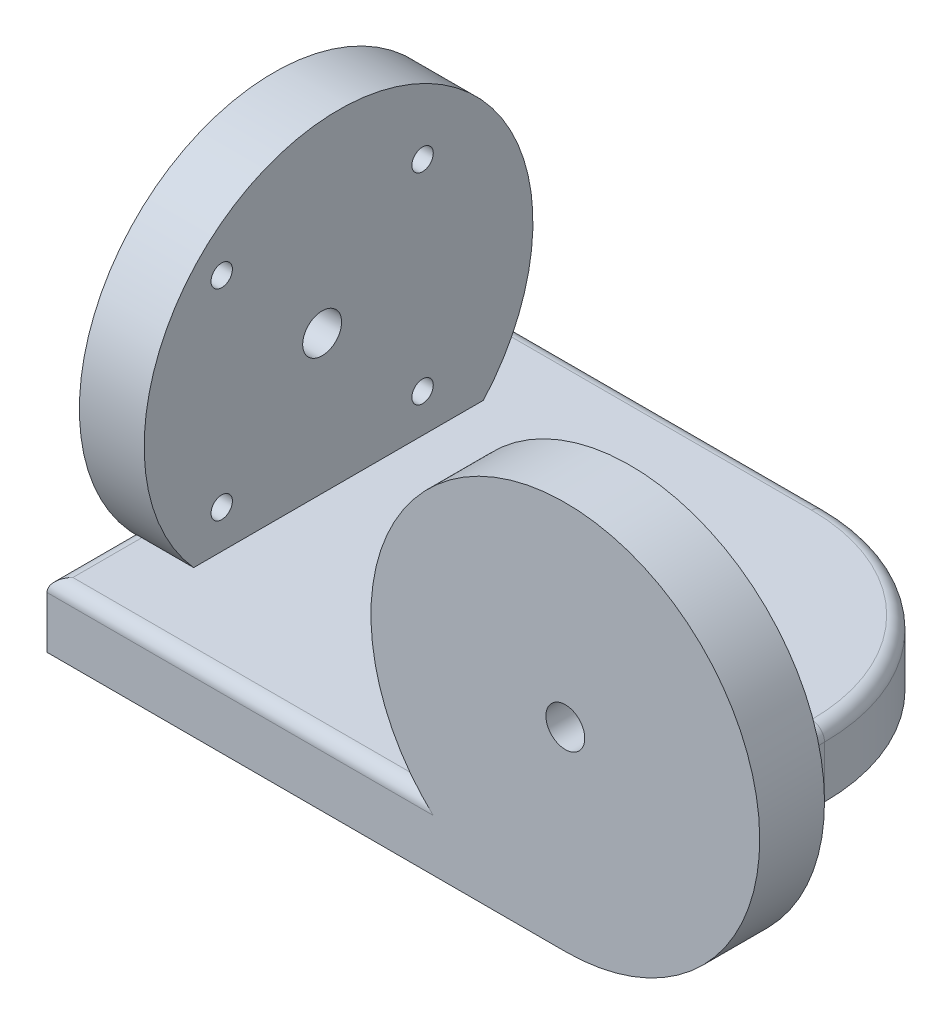
ISO-10303-21;
HEADER;
FILE_DESCRIPTION(('STEP AP214'),'2;1');
FILE_NAME('part.step','',(''),(''),'','','');
FILE_SCHEMA(('AUTOMOTIVE_DESIGN { 1 0 10303 214 1 1 1 1 }'));
ENDSEC;
DATA;
#1=APPLICATION_CONTEXT('core data for automotive mechanical design processes');
#2=APPLICATION_PROTOCOL_DEFINITION('international standard','automotive_design',2000,#1);
#3=PRODUCT_CONTEXT('',#1,'mechanical');
#4=PRODUCT('Part','Part','',(#3));
#5=PRODUCT_RELATED_PRODUCT_CATEGORY('part','',(#4));
#6=PRODUCT_DEFINITION_FORMATION('','',#4);
#7=PRODUCT_DEFINITION_CONTEXT('part definition',#1,'design');
#8=PRODUCT_DEFINITION('design','',#6,#7);
#9=PRODUCT_DEFINITION_SHAPE('','',#8);
#10=(LENGTH_UNIT() NAMED_UNIT(*) SI_UNIT(.MILLI.,.METRE.));
#11=(NAMED_UNIT(*) PLANE_ANGLE_UNIT() SI_UNIT($,.RADIAN.));
#12=(NAMED_UNIT(*) SI_UNIT($,.STERADIAN.) SOLID_ANGLE_UNIT());
#13=UNCERTAINTY_MEASURE_WITH_UNIT(LENGTH_MEASURE(1.E-05),#10,'distance_accuracy_value','');
#14=(GEOMETRIC_REPRESENTATION_CONTEXT(3) GLOBAL_UNCERTAINTY_ASSIGNED_CONTEXT((#13)) GLOBAL_UNIT_ASSIGNED_CONTEXT((#10,
#11,#12)) REPRESENTATION_CONTEXT('',''));
#15=CARTESIAN_POINT('',(0.,0.,0.));
#16=DIRECTION('',(0.,0.,1.));
#17=DIRECTION('',(1.,0.,0.));
#18=AXIS2_PLACEMENT_3D('',#15,#16,#17);
#19=CARTESIAN_POINT('',(0.,0.,10.));
#20=DIRECTION('',(0.,0.,-1.));
#21=DIRECTION('',(-1.,0.,0.));
#22=AXIS2_PLACEMENT_3D('',#19,#20,#21);
#23=CYLINDRICAL_SURFACE('',#22,30.);
#24=CARTESIAN_POINT('',(0.,0.,10.));
#25=DIRECTION('',(0.,0.,1.));
#26=DIRECTION('',(1.,0.,0.));
#27=AXIS2_PLACEMENT_3D('',#24,#25,#26);
#28=CIRCLE('',#27,30.);
#29=CARTESIAN_POINT('',(0.,-30.,10.));
#30=VERTEX_POINT('',#29);
#31=CARTESIAN_POINT('',(-20.3960780543711,-22.,10.));
#32=VERTEX_POINT('',#31);
#33=EDGE_CURVE('E54',#30,#32,#28,.T.);
#34=ORIENTED_EDGE('',*,*,#33,.F.);
#35=DIRECTION('',(0.,0.,1.));
#36=VECTOR('',#35,1.);
#37=CARTESIAN_POINT('',(0.,-30.,-60.));
#38=LINE('',#37,#36);
#39=CARTESIAN_POINT('',(0.,-30.,0.));
#40=VERTEX_POINT('',#39);
#41=EDGE_CURVE('E251',#40,#30,#38,.T.);
#42=ORIENTED_EDGE('',*,*,#41,.F.);
#43=CARTESIAN_POINT('',(0.,0.,0.));
#44=DIRECTION('',(0.,0.,1.));
#45=DIRECTION('',(1.,0.,0.));
#46=AXIS2_PLACEMENT_3D('',#43,#44,#45);
#47=CIRCLE('',#46,30.);
#48=CARTESIAN_POINT('',(-22.3606797749979,-20.,0.));
#49=VERTEX_POINT('',#48);
#50=EDGE_CURVE('E256',#40,#49,#47,.T.);
#51=ORIENTED_EDGE('',*,*,#50,.T.);
#52=DIRECTION('',(0.,0.,-1.));
#53=VECTOR('',#52,1.);
#54=CARTESIAN_POINT('',(-22.3606797749979,-20.,10.));
#55=LINE('',#54,#53);
#56=CARTESIAN_POINT('',(-22.3606797749979,-20.,8.));
#57=VERTEX_POINT('',#56);
#58=EDGE_CURVE('E250',#49,#57,#55,.F.);
#59=ORIENTED_EDGE('',*,*,#58,.T.);
#60=CARTESIAN_POINT('',(-22.3606797749979,-20.,8.));
#61=CARTESIAN_POINT('',(-22.3606878421767,-19.999989597427,8.04591763944881));
#62=CARTESIAN_POINT('',(-22.3592656623581,-20.0015809948871,8.09182840912849));
#63=CARTESIAN_POINT('',(-22.3536230016139,-20.0078877260654,8.18323544647668));
#64=CARTESIAN_POINT('',(-22.349404170593,-20.0126012178798,8.22873194251547));
#65=CARTESIAN_POINT('',(-22.3382692933674,-20.0250290871268,8.3186495253648));
#66=CARTESIAN_POINT('',(-22.3313722941767,-20.0327222721457,8.36307590430454));
#67=CARTESIAN_POINT('',(-22.3149970756365,-20.0509614669823,8.45084482003631));
#68=CARTESIAN_POINT('',(-22.3055185983413,-20.0615077618867,8.49418724804535));
#69=CARTESIAN_POINT('',(-22.2734531597014,-20.0971218866478,8.62196357423329));
#70=CARTESIAN_POINT('',(-22.2472017189939,-20.1262036919429,8.70441633757704));
#71=CARTESIAN_POINT('',(-22.1862528189484,-20.1933711794225,8.86225880382188));
#72=CARTESIAN_POINT('',(-22.1515401289163,-20.23147309468,8.93763542653979));
#73=CARTESIAN_POINT('',(-22.0621200405999,-20.3290076677315,9.10454011859884));
#74=CARTESIAN_POINT('',(-22.0046208907631,-20.3912962537848,9.19290860989961));
#75=CARTESIAN_POINT('',(-21.8800368354089,-20.5249207799933,9.35469472127389));
#76=CARTESIAN_POINT('',(-21.8129385534815,-20.5962693293656,9.42809112556555));
#77=CARTESIAN_POINT('',(-21.6466107852719,-20.7712158562002,9.58373545782283));
#78=CARTESIAN_POINT('',(-21.54439847616,-20.8773090625627,9.65996651335575));
#79=CARTESIAN_POINT('',(-21.3309886715335,-21.095315082405,9.78818478963192));
#80=CARTESIAN_POINT('',(-21.2197650720727,-21.2072444421476,9.84009839125444));
#81=CARTESIAN_POINT('',(-21.0485020999664,-21.3767886990694,9.90137564217989));
#82=CARTESIAN_POINT('',(-20.990560936849,-21.4336893779654,9.91905376342129));
#83=CARTESIAN_POINT('',(-20.8734930783118,-21.5477133610329,9.94908010448159));
#84=CARTESIAN_POINT('',(-20.8143662078776,-21.6048366970519,9.96142753132083));
#85=CARTESIAN_POINT('',(-20.6957282769602,-21.718506391839,9.980924005222));
#86=CARTESIAN_POINT('',(-20.6362250204988,-21.7750534506961,9.98811729511402));
#87=CARTESIAN_POINT('',(-20.5165822365846,-21.8878192770043,9.99765053707952));
#88=CARTESIAN_POINT('',(-20.4564430775043,-21.9440382080708,9.99999315923709));
#89=CARTESIAN_POINT('',(-20.3960780543711,-22.,10.));
#90=B_SPLINE_CURVE_WITH_KNOTS('',3,(#60,#61,#62,#63,#64,#65,#66,#67,#68,#69,#70,#71,#72,#73,#74,
#75,#76,#77,#78,#79,#80,#81,#82,#83,#84,#85,#86,#87,#88,#89),.UNSPECIFIED.,.F.,.F.,(4,2,2,2,2,2,
2,2,2,2,2,2,2,2,4),(0.,0.137692071046513,0.275302981859435,0.41195262413229,0.548615925681093,
0.821129149331836,1.09413658140956,1.45947886124377,1.82533529706436,2.3203016483611,
2.81675693703241,3.06594369981729,3.31516751818779,3.5622255145992,3.80914748001016),.UNSPECIFIED.);
#91=EDGE_CURVE('E11',#57,#32,#90,.T.);
#92=ORIENTED_EDGE('',*,*,#91,.T.);
#93=EDGE_LOOP('',(#34,#42,#51,#59,#92));
#94=FACE_BOUND('',#93,.T.);
#95=ADVANCED_FACE('F36',(#94),#23,.T.);
#96=CARTESIAN_POINT('',(0.,0.,10.));
#97=DIRECTION('',(0.,0.,1.));
#98=DIRECTION('',(1.,0.,0.));
#99=AXIS2_PLACEMENT_3D('',#96,#97,#98);
#100=PLANE('',#99);
#101=CARTESIAN_POINT('',(0.,0.,10.));
#102=DIRECTION('',(0.,0.,-1.));
#103=DIRECTION('',(-1.,0.,0.));
#104=AXIS2_PLACEMENT_3D('',#101,#102,#103);
#105=CIRCLE('',#104,3.);
#106=CARTESIAN_POINT('',(-3.,0.,10.));
#107=VERTEX_POINT('',#106);
#108=EDGE_CURVE('E222',#107,#107,#105,.T.);
#109=ORIENTED_EDGE('',*,*,#108,.T.);
#110=EDGE_LOOP('',(#109));
#111=FACE_BOUND('',#110,.T.);
#112=ORIENTED_EDGE('',*,*,#33,.T.);
#113=DIRECTION('',(-1.,0.,0.));
#114=VECTOR('',#113,1.);
#115=CARTESIAN_POINT('',(0.,-22.,10.));
#116=LINE('',#115,#114);
#117=CARTESIAN_POINT('',(-80.,-22.,10.));
#118=VERTEX_POINT('',#117);
#119=EDGE_CURVE('E294',#32,#118,#116,.T.);
#120=ORIENTED_EDGE('',*,*,#119,.T.);
#121=DIRECTION('',(0.,-1.,0.));
#122=VECTOR('',#121,1.);
#123=CARTESIAN_POINT('',(-80.,-30.,10.));
#124=LINE('',#123,#122);
#125=CARTESIAN_POINT('',(-80.,-30.,10.));
#126=VERTEX_POINT('',#125);
#127=EDGE_CURVE('E238',#118,#126,#124,.T.);
#128=ORIENTED_EDGE('',*,*,#127,.T.);
#129=DIRECTION('',(1.,0.,0.));
#130=VECTOR('',#129,1.);
#131=CARTESIAN_POINT('',(0.,-30.,10.));
#132=LINE('',#131,#130);
#133=EDGE_CURVE('E242',#126,#30,#132,.T.);
#134=ORIENTED_EDGE('',*,*,#133,.T.);
#135=EDGE_LOOP('',(#112,#120,#128,#134));
#136=FACE_BOUND('',#135,.T.);
#137=ADVANCED_FACE('F344',(#111,#136),#100,.T.);
#138=CARTESIAN_POINT('',(0.,0.,0.));
#139=DIRECTION('',(0.,0.,1.));
#140=DIRECTION('',(1.,0.,0.));
#141=AXIS2_PLACEMENT_3D('',#138,#139,#140);
#142=PLANE('',#141);
#143=CARTESIAN_POINT('',(15.5,15.5,0.));
#144=DIRECTION('',(0.,0.,-1.));
#145=DIRECTION('',(-1.,0.,0.));
#146=AXIS2_PLACEMENT_3D('',#143,#144,#145);
#147=CIRCLE('',#146,1.64999999999999);
#148=CARTESIAN_POINT('',(13.85,15.5,0.));
#149=VERTEX_POINT('',#148);
#150=EDGE_CURVE('E195',#149,#149,#147,.T.);
#151=ORIENTED_EDGE('',*,*,#150,.F.);
#152=EDGE_LOOP('',(#151));
#153=FACE_BOUND('',#152,.T.);
#154=CARTESIAN_POINT('',(-15.5,15.5,0.));
#155=DIRECTION('',(0.,0.,-1.));
#156=DIRECTION('',(-1.,0.,0.));
#157=AXIS2_PLACEMENT_3D('',#154,#155,#156);
#158=CIRCLE('',#157,1.64999999999999);
#159=CARTESIAN_POINT('',(-17.15,15.5,0.));
#160=VERTEX_POINT('',#159);
#161=EDGE_CURVE('E201',#160,#160,#158,.T.);
#162=ORIENTED_EDGE('',*,*,#161,.F.);
#163=EDGE_LOOP('',(#162));
#164=FACE_BOUND('',#163,.T.);
#165=CARTESIAN_POINT('',(-15.5,-15.5,0.));
#166=DIRECTION('',(0.,0.,-1.));
#167=DIRECTION('',(-1.,0.,0.));
#168=AXIS2_PLACEMENT_3D('',#165,#166,#167);
#169=CIRCLE('',#168,1.64999999999999);
#170=CARTESIAN_POINT('',(-17.15,-15.5,0.));
#171=VERTEX_POINT('',#170);
#172=EDGE_CURVE('E207',#171,#171,#169,.T.);
#173=ORIENTED_EDGE('',*,*,#172,.F.);
#174=EDGE_LOOP('',(#173));
#175=FACE_BOUND('',#174,.T.);
#176=CARTESIAN_POINT('',(15.5,-15.5,0.));
#177=DIRECTION('',(0.,0.,-1.));
#178=DIRECTION('',(-1.,0.,0.));
#179=AXIS2_PLACEMENT_3D('',#176,#177,#178);
#180=CIRCLE('',#179,1.64999999999999);
#181=CARTESIAN_POINT('',(13.85,-15.5,0.));
#182=VERTEX_POINT('',#181);
#183=EDGE_CURVE('E213',#182,#182,#180,.T.);
#184=ORIENTED_EDGE('',*,*,#183,.F.);
#185=EDGE_LOOP('',(#184));
#186=FACE_BOUND('',#185,.T.);
#187=CARTESIAN_POINT('',(0.,0.,0.));
#188=DIRECTION('',(0.,0.,-1.));
#189=DIRECTION('',(-1.,0.,0.));
#190=AXIS2_PLACEMENT_3D('',#187,#188,#189);
#191=CIRCLE('',#190,2.99999999999999);
#192=CARTESIAN_POINT('',(-2.99999999999999,0.,0.));
#193=VERTEX_POINT('',#192);
#194=EDGE_CURVE('E219',#193,#193,#191,.T.);
#195=ORIENTED_EDGE('',*,*,#194,.F.);
#196=EDGE_LOOP('',(#195));
#197=FACE_BOUND('',#196,.T.);
#198=ORIENTED_EDGE('',*,*,#50,.F.);
#199=DIRECTION('',(0.,1.,0.));
#200=VECTOR('',#199,1.);
#201=CARTESIAN_POINT('',(0.,0.,0.));
#202=LINE('',#201,#200);
#203=CARTESIAN_POINT('',(0.,-22.,0.));
#204=VERTEX_POINT('',#203);
#205=EDGE_CURVE('E262',#40,#204,#202,.T.);
#206=ORIENTED_EDGE('',*,*,#205,.T.);
#207=CARTESIAN_POINT('',(-2.,-22.,0.));
#208=DIRECTION('',(0.,0.,1.));
#209=DIRECTION('',(1.,0.,0.));
#210=AXIS2_PLACEMENT_3D('',#207,#208,#209);
#211=CIRCLE('',#210,2.);
#212=CARTESIAN_POINT('',(-2.,-20.,0.));
#213=VERTEX_POINT('',#212);
#214=EDGE_CURVE('E46',#204,#213,#211,.T.);
#215=ORIENTED_EDGE('',*,*,#214,.T.);
#216=DIRECTION('',(-1.,0.,0.));
#217=VECTOR('',#216,1.);
#218=CARTESIAN_POINT('',(0.,-20.,0.));
#219=LINE('',#218,#217);
#220=EDGE_CURVE('E258',#213,#49,#219,.T.);
#221=ORIENTED_EDGE('',*,*,#220,.T.);
#222=EDGE_LOOP('',(#198,#206,#215,#221));
#223=FACE_BOUND('',#222,.T.);
#224=ADVANCED_FACE('F343',(#153,#164,#175,#186,#197,#223),#142,.F.);
#225=CARTESIAN_POINT('',(0.,-30.,-60.));
#226=DIRECTION('',(1.,0.,0.));
#227=DIRECTION('',(0.,0.,-1.));
#228=AXIS2_PLACEMENT_3D('',#225,#226,#227);
#229=PLANE('',#228);
#230=DIRECTION('',(0.,1.,0.));
#231=VECTOR('',#230,1.);
#232=CARTESIAN_POINT('',(0.,-20.,-30.));
#233=LINE('',#232,#231);
#234=CARTESIAN_POINT('',(0.,-30.,-30.));
#235=VERTEX_POINT('',#234);
#236=CARTESIAN_POINT('',(0.,-22.,-30.));
#237=VERTEX_POINT('',#236);
#238=EDGE_CURVE('E264',#235,#237,#233,.T.);
#239=ORIENTED_EDGE('',*,*,#238,.T.);
#240=DIRECTION('',(0.,0.,1.));
#241=VECTOR('',#240,1.);
#242=CARTESIAN_POINT('',(0.,-22.,-60.));
#243=LINE('',#242,#241);
#244=EDGE_CURVE('E61',#237,#204,#243,.T.);
#245=ORIENTED_EDGE('',*,*,#244,.T.);
#246=ORIENTED_EDGE('',*,*,#205,.F.);
#247=EDGE_CURVE('E248',#235,#40,#38,.T.);
#248=ORIENTED_EDGE('',*,*,#247,.F.);
#249=EDGE_LOOP('',(#239,#245,#246,#248));
#250=FACE_BOUND('',#249,.T.);
#251=ADVANCED_FACE('F339',(#250),#229,.T.);
#252=CARTESIAN_POINT('',(0.,-20.,-60.));
#253=DIRECTION('',(0.,1.,0.));
#254=DIRECTION('',(-1.,0.,0.));
#255=AXIS2_PLACEMENT_3D('',#252,#253,#254);
#256=PLANE('',#255);
#257=DIRECTION('',(-1.,0.,0.));
#258=VECTOR('',#257,1.);
#259=CARTESIAN_POINT('',(-80.,-20.,-58.));
#260=LINE('',#259,#258);
#261=CARTESIAN_POINT('',(-30.,-20.,-58.));
#262=VERTEX_POINT('',#261);
#263=CARTESIAN_POINT('',(-78.,-20.,-58.));
#264=VERTEX_POINT('',#263);
#265=EDGE_CURVE('E279',#262,#264,#260,.T.);
#266=ORIENTED_EDGE('',*,*,#265,.T.);
#267=DIRECTION('',(0.,0.,1.));
#268=VECTOR('',#267,1.);
#269=CARTESIAN_POINT('',(-78.,-20.,-60.));
#270=LINE('',#269,#268);
#271=CARTESIAN_POINT('',(-78.,-20.,-47.3606797749979));
#272=VERTEX_POINT('',#271);
#273=EDGE_CURVE('E282',#264,#272,#270,.T.);
#274=ORIENTED_EDGE('',*,*,#273,.T.);
#275=DIRECTION('',(-1.,0.,0.));
#276=VECTOR('',#275,1.);
#277=CARTESIAN_POINT('',(-70.,-20.,-47.3606797749979));
#278=LINE('',#277,#276);
#279=CARTESIAN_POINT('',(-70.,-20.,-47.3606797749979));
#280=VERTEX_POINT('',#279);
#281=EDGE_CURVE('E232',#280,#272,#278,.T.);
#282=ORIENTED_EDGE('',*,*,#281,.F.);
#283=DIRECTION('',(0.,0.,1.));
#284=VECTOR('',#283,1.);
#285=CARTESIAN_POINT('',(-70.,-20.,-60.));
#286=LINE('',#285,#284);
#287=CARTESIAN_POINT('',(-70.,-20.,-2.6393202250021));
#288=VERTEX_POINT('',#287);
#289=EDGE_CURVE('E235',#280,#288,#286,.T.);
#290=ORIENTED_EDGE('',*,*,#289,.T.);
#291=DIRECTION('',(-1.,0.,0.));
#292=VECTOR('',#291,1.);
#293=CARTESIAN_POINT('',(-70.,-20.,-2.6393202250021));
#294=LINE('',#293,#292);
#295=CARTESIAN_POINT('',(-78.,-20.,-2.6393202250021));
#296=VERTEX_POINT('',#295);
#297=EDGE_CURVE('E229',#296,#288,#294,.F.);
#298=ORIENTED_EDGE('',*,*,#297,.F.);
#299=DIRECTION('',(0.,0.,1.));
#300=VECTOR('',#299,1.);
#301=CARTESIAN_POINT('',(-78.,-20.,-60.));
#302=LINE('',#301,#300);
#303=CARTESIAN_POINT('',(-78.,-20.,8.));
#304=VERTEX_POINT('',#303);
#305=EDGE_CURVE('E272',#296,#304,#302,.T.);
#306=ORIENTED_EDGE('',*,*,#305,.T.);
#307=DIRECTION('',(-1.,0.,0.));
#308=VECTOR('',#307,1.);
#309=CARTESIAN_POINT('',(0.,-20.,8.));
#310=LINE('',#309,#308);
#311=EDGE_CURVE('E270',#304,#57,#310,.F.);
#312=ORIENTED_EDGE('',*,*,#311,.T.);
#313=ORIENTED_EDGE('',*,*,#58,.F.);
#314=ORIENTED_EDGE('',*,*,#220,.F.);
#315=DIRECTION('',(0.,0.,1.));
#316=VECTOR('',#315,1.);
#317=CARTESIAN_POINT('',(-2.,-20.,-60.));
#318=LINE('',#317,#316);
#319=CARTESIAN_POINT('',(-2.,-20.,-30.));
#320=VERTEX_POINT('',#319);
#321=EDGE_CURVE('E275',#213,#320,#318,.F.);
#322=ORIENTED_EDGE('',*,*,#321,.T.);
#323=CARTESIAN_POINT('',(-30.,-20.,-30.));
#324=DIRECTION('',(0.,1.,0.));
#325=DIRECTION('',(-1.,0.,0.));
#326=AXIS2_PLACEMENT_3D('',#323,#324,#325);
#327=CIRCLE('',#326,28.);
#328=EDGE_CURVE('E277',#320,#262,#327,.T.);
#329=ORIENTED_EDGE('',*,*,#328,.T.);
#330=EDGE_LOOP('',(#266,#274,#282,#290,#298,#306,#312,#313,#314,#322,#329));
#331=FACE_BOUND('',#330,.T.);
#332=ADVANCED_FACE('F332',(#331),#256,.T.);
#333=CARTESIAN_POINT('',(0.,-30.,-60.));
#334=DIRECTION('',(0.,-1.,0.));
#335=DIRECTION('',(1.,0.,0.));
#336=AXIS2_PLACEMENT_3D('',#333,#334,#335);
#337=PLANE('',#336);
#338=DIRECTION('',(1.,0.,0.));
#339=VECTOR('',#338,1.);
#340=CARTESIAN_POINT('',(0.,-30.,-60.));
#341=LINE('',#340,#339);
#342=CARTESIAN_POINT('',(-80.,-30.,-60.));
#343=VERTEX_POINT('',#342);
#344=CARTESIAN_POINT('',(-30.,-30.,-60.));
#345=VERTEX_POINT('',#344);
#346=EDGE_CURVE('E241',#343,#345,#341,.T.);
#347=ORIENTED_EDGE('',*,*,#346,.T.);
#348=CARTESIAN_POINT('',(-30.,-30.,-30.));
#349=DIRECTION('',(0.,-1.,0.));
#350=DIRECTION('',(1.,0.,0.));
#351=AXIS2_PLACEMENT_3D('',#348,#349,#350);
#352=CIRCLE('',#351,30.);
#353=EDGE_CURVE('E268',#345,#235,#352,.T.);
#354=ORIENTED_EDGE('',*,*,#353,.T.);
#355=ORIENTED_EDGE('',*,*,#247,.T.);
#356=ORIENTED_EDGE('',*,*,#41,.T.);
#357=ORIENTED_EDGE('',*,*,#133,.F.);
#358=DIRECTION('',(0.,0.,1.));
#359=VECTOR('',#358,1.);
#360=CARTESIAN_POINT('',(-80.,-30.,-60.));
#361=LINE('',#360,#359);
#362=EDGE_CURVE('E245',#343,#126,#361,.T.);
#363=ORIENTED_EDGE('',*,*,#362,.F.);
#364=EDGE_LOOP('',(#347,#354,#355,#356,#357,#363));
#365=FACE_BOUND('',#364,.T.);
#366=ADVANCED_FACE('F329',(#365),#337,.T.);
#367=CARTESIAN_POINT('',(-80.,-30.,-60.));
#368=DIRECTION('',(-1.,0.,0.));
#369=DIRECTION('',(0.,0.,1.));
#370=AXIS2_PLACEMENT_3D('',#367,#368,#369);
#371=PLANE('',#370);
#372=CARTESIAN_POINT('',(-80.,1.40707775675253,-22.4690416670796));
#373=DIRECTION('',(1.,0.,0.));
#374=DIRECTION('',(0.,0.,-1.));
#375=AXIS2_PLACEMENT_3D('',#372,#373,#374);
#376=CIRCLE('',#375,3.);
#377=CARTESIAN_POINT('',(-80.,1.40707775675253,-25.4690416670796));
#378=VERTEX_POINT('',#377);
#379=EDGE_CURVE('E192',#378,#378,#376,.T.);
#380=ORIENTED_EDGE('',*,*,#379,.T.);
#381=EDGE_LOOP('',(#380));
#382=FACE_BOUND('',#381,.T.);
#383=CARTESIAN_POINT('',(-80.,0.,-25.));
#384=DIRECTION('',(-1.,0.,0.));
#385=DIRECTION('',(0.,0.,1.));
#386=AXIS2_PLACEMENT_3D('',#383,#384,#385);
#387=CIRCLE('',#386,30.);
#388=CARTESIAN_POINT('',(-80.,-22.,-4.60392194562886));
#389=VERTEX_POINT('',#388);
#390=CARTESIAN_POINT('',(-80.,-22.,-45.3960780543711));
#391=VERTEX_POINT('',#390);
#392=EDGE_CURVE('E225',#389,#391,#387,.T.);
#393=ORIENTED_EDGE('',*,*,#392,.T.);
#394=DIRECTION('',(0.,0.,1.));
#395=VECTOR('',#394,1.);
#396=CARTESIAN_POINT('',(-80.,-22.,-60.));
#397=LINE('',#396,#395);
#398=CARTESIAN_POINT('',(-80.,-22.,-60.));
#399=VERTEX_POINT('',#398);
#400=EDGE_CURVE('E291',#391,#399,#397,.F.);
#401=ORIENTED_EDGE('',*,*,#400,.T.);
#402=DIRECTION('',(0.,-1.,0.));
#403=VECTOR('',#402,1.);
#404=CARTESIAN_POINT('',(-80.,-30.,-60.));
#405=LINE('',#404,#403);
#406=EDGE_CURVE('E239',#399,#343,#405,.T.);
#407=ORIENTED_EDGE('',*,*,#406,.T.);
#408=ORIENTED_EDGE('',*,*,#362,.T.);
#409=ORIENTED_EDGE('',*,*,#127,.F.);
#410=DIRECTION('',(0.,0.,1.));
#411=VECTOR('',#410,1.);
#412=CARTESIAN_POINT('',(-80.,-22.,-60.));
#413=LINE('',#412,#411);
#414=EDGE_CURVE('E288',#118,#389,#413,.F.);
#415=ORIENTED_EDGE('',*,*,#414,.T.);
#416=EDGE_LOOP('',(#393,#401,#407,#408,#409,#415));
#417=FACE_BOUND('',#416,.T.);
#418=ADVANCED_FACE('F327',(#382,#417),#371,.T.);
#419=CARTESIAN_POINT('',(0.,0.,-60.));
#420=DIRECTION('',(0.,0.,1.));
#421=DIRECTION('',(1.,0.,0.));
#422=AXIS2_PLACEMENT_3D('',#419,#420,#421);
#423=PLANE('',#422);
#424=ORIENTED_EDGE('',*,*,#406,.F.);
#425=DIRECTION('',(-1.,0.,0.));
#426=VECTOR('',#425,1.);
#427=CARTESIAN_POINT('',(-30.,-22.,-60.));
#428=LINE('',#427,#426);
#429=CARTESIAN_POINT('',(-30.,-22.,-60.));
#430=VERTEX_POINT('',#429);
#431=EDGE_CURVE('E284',#399,#430,#428,.F.);
#432=ORIENTED_EDGE('',*,*,#431,.T.);
#433=DIRECTION('',(0.,1.,0.));
#434=VECTOR('',#433,1.);
#435=CARTESIAN_POINT('',(-30.,-30.,-60.));
#436=LINE('',#435,#434);
#437=EDGE_CURVE('E266',#430,#345,#436,.F.);
#438=ORIENTED_EDGE('',*,*,#437,.T.);
#439=ORIENTED_EDGE('',*,*,#346,.F.);
#440=EDGE_LOOP('',(#424,#432,#438,#439));
#441=FACE_BOUND('',#440,.T.);
#442=ADVANCED_FACE('F321',(#441),#423,.F.);
#443=CARTESIAN_POINT('',(-70.,0.,-25.));
#444=DIRECTION('',(-1.,0.,0.));
#445=DIRECTION('',(0.,0.,1.));
#446=AXIS2_PLACEMENT_3D('',#443,#444,#445);
#447=CYLINDRICAL_SURFACE('',#446,30.);
#448=CARTESIAN_POINT('',(-70.,0.,-25.));
#449=DIRECTION('',(-1.,0.,0.));
#450=DIRECTION('',(0.,0.,1.));
#451=AXIS2_PLACEMENT_3D('',#448,#449,#450);
#452=CIRCLE('',#451,30.);
#453=EDGE_CURVE('E226',#288,#280,#452,.T.);
#454=ORIENTED_EDGE('',*,*,#453,.T.);
#455=ORIENTED_EDGE('',*,*,#281,.T.);
#456=CARTESIAN_POINT('',(-78.,-20.,-47.3606797749979));
#457=CARTESIAN_POINT('',(-78.0459176394488,-19.999989597427,-47.3606878421767));
#458=CARTESIAN_POINT('',(-78.0918284091285,-20.0015809948871,-47.3592656623581));
#459=CARTESIAN_POINT('',(-78.1832354464767,-20.0078877260654,-47.3536230016139));
#460=CARTESIAN_POINT('',(-78.2287319425155,-20.0126012178798,-47.349404170593));
#461=CARTESIAN_POINT('',(-78.3186495253648,-20.0250290871269,-47.3382692933674));
#462=CARTESIAN_POINT('',(-78.3630759043046,-20.0327222721457,-47.3313722941767));
#463=CARTESIAN_POINT('',(-78.4508448200363,-20.0509614669823,-47.3149970756365));
#464=CARTESIAN_POINT('',(-78.4941872480453,-20.0615077618868,-47.3055185983413));
#465=CARTESIAN_POINT('',(-78.6219635742333,-20.0971218866478,-47.2734531597014));
#466=CARTESIAN_POINT('',(-78.704416337577,-20.126203691943,-47.2472017189939));
#467=CARTESIAN_POINT('',(-78.8622588038219,-20.1933711794225,-47.1862528189484));
#468=CARTESIAN_POINT('',(-78.9376354265398,-20.23147309468,-47.1515401289163));
#469=CARTESIAN_POINT('',(-79.1045401185988,-20.3290076677315,-47.0621200406));
#470=CARTESIAN_POINT('',(-79.1929086098996,-20.3912962537848,-47.0046208907631));
#471=CARTESIAN_POINT('',(-79.3546947212739,-20.5249207799933,-46.8800368354089));
#472=CARTESIAN_POINT('',(-79.4280911255655,-20.5962693293657,-46.8129385534815));
#473=CARTESIAN_POINT('',(-79.5837354578228,-20.7712158562002,-46.6466107852719));
#474=CARTESIAN_POINT('',(-79.6599665133558,-20.8773090625627,-46.54439847616));
#475=CARTESIAN_POINT('',(-79.7881847896319,-21.095315082405,-46.3309886715335));
#476=CARTESIAN_POINT('',(-79.8400983912544,-21.2072444421476,-46.2197650720727));
#477=CARTESIAN_POINT('',(-79.9013756421799,-21.3767886990694,-46.0485020999664));
#478=CARTESIAN_POINT('',(-79.9190537634213,-21.4336893779654,-45.990560936849));
#479=CARTESIAN_POINT('',(-79.9490801044816,-21.5477133610329,-45.8734930783118));
#480=CARTESIAN_POINT('',(-79.9614275313208,-21.6048366970519,-45.8143662078776));
#481=CARTESIAN_POINT('',(-79.980924005222,-21.718506391839,-45.6957282769603));
#482=CARTESIAN_POINT('',(-79.988117295114,-21.7750534506961,-45.6362250204988));
#483=CARTESIAN_POINT('',(-79.9976505370795,-21.8878192770043,-45.5165822365847));
#484=CARTESIAN_POINT('',(-79.9999931592371,-21.9440382080708,-45.4564430775043));
#485=CARTESIAN_POINT('',(-80.,-22.,-45.3960780543711));
#486=B_SPLINE_CURVE_WITH_KNOTS('',3,(#456,#457,#458,#459,#460,#461,#462,#463,#464,#465,#466,
#467,#468,#469,#470,#471,#472,#473,#474,#475,#476,#477,#478,#479,#480,#481,#482,#483,#484,#485),
.UNSPECIFIED.,.F.,.F.,(4,2,2,2,2,2,2,2,2,2,2,2,2,2,4),(0.,0.137692071046516,0.275302981859452,
0.411952624132303,0.548615925681086,0.821129149331827,1.09413658140955,1.45947886124377,
1.82533529706436,2.3203016483611,2.81675693703241,3.06594369981729,3.31516751818778,
3.5622255145992,3.80914748001016),.UNSPECIFIED.);
#487=EDGE_CURVE('E296',#272,#391,#486,.T.);
#488=ORIENTED_EDGE('',*,*,#487,.T.);
#489=ORIENTED_EDGE('',*,*,#392,.F.);
#490=CARTESIAN_POINT('',(-80.,-22.,-4.60392194562886));
#491=CARTESIAN_POINT('',(-79.9999786720905,-21.9250969696956,-4.52311990205737));
#492=CARTESIAN_POINT('',(-79.9957893522744,-21.849713297129,-4.44270947507081));
#493=CARTESIAN_POINT('',(-79.9786015661422,-21.6983829842528,-4.28304540866335));
#494=CARTESIAN_POINT('',(-79.9655837838201,-21.6224354714265,-4.20379469583014));
#495=CARTESIAN_POINT('',(-79.9300679851909,-21.4698763321137,-4.04632308617306));
#496=CARTESIAN_POINT('',(-79.9074674121436,-21.3932665735471,-3.96812306123055));
#497=CARTESIAN_POINT('',(-79.8521922644683,-21.2410983657287,-3.814452500114));
#498=CARTESIAN_POINT('',(-79.8195278814959,-21.165538933348,-3.73897928848862));
#499=CARTESIAN_POINT('',(-79.7325264255868,-20.9950355332516,-3.57042646369233));
#500=CARTESIAN_POINT('',(-79.6746633861554,-20.9007232208339,-3.4784796492389));
#501=CARTESIAN_POINT('',(-79.5397533299124,-20.7186202520838,-3.30311860459992));
#502=CARTESIAN_POINT('',(-79.4627795088676,-20.6308063348206,-3.21967349351749));
#503=CARTESIAN_POINT('',(-79.3070493656393,-20.4832444629862,-3.08095136744559));
#504=CARTESIAN_POINT('',(-79.2321712568209,-20.4215041968031,-3.02346171944637));
#505=CARTESIAN_POINT('',(-79.069729052503,-20.3072185287842,-2.91781445476276));
#506=CARTESIAN_POINT('',(-78.9821736065571,-20.2546669112121,-2.869650527232));
#507=CARTESIAN_POINT('',(-78.8120722951011,-20.1702774700171,-2.79273579883283));
#508=CARTESIAN_POINT('',(-78.7314065419417,-20.1364178124556,-2.7620556860736));
#509=CARTESIAN_POINT('',(-78.5636540652972,-20.0790322633174,-2.71022738190236));
#510=CARTESIAN_POINT('',(-78.4765795906722,-20.0554872274003,-2.68906152972921));
#511=CARTESIAN_POINT('',(-78.3243499046315,-20.0254289050288,-2.66208405722425));
#512=CARTESIAN_POINT('',(-78.2602372042845,-20.0159477938441,-2.65359177262193));
#513=CARTESIAN_POINT('',(-78.1307701320775,-20.0032088990404,-2.64219033513485));
#514=CARTESIAN_POINT('',(-78.0654133687489,-19.999964657808,-2.63929333146322));
#515=CARTESIAN_POINT('',(-78.,-20.,-2.6393202250021));
#516=B_SPLINE_CURVE_WITH_KNOTS('',3,(#490,#491,#492,#493,#494,#495,#496,#497,#498,#499,#500,
#501,#502,#503,#504,#505,#506,#507,#508,#509,#510,#511,#512,#513,#514,#515),.UNSPECIFIED.,.F.,
.F.,(4,2,2,2,2,2,2,2,2,2,2,2,4),(0.,0.330515879121519,0.661757244873314,0.996636836915789,
1.33117840378061,1.7613310670957,2.18986096371834,2.52703574682131,2.86398155537457,
3.14098050227012,3.41746312731512,3.61303525221818,3.80903155384988),.UNSPECIFIED.);
#517=EDGE_CURVE('E305',#389,#296,#516,.T.);
#518=ORIENTED_EDGE('',*,*,#517,.T.);
#519=ORIENTED_EDGE('',*,*,#297,.T.);
#520=EDGE_LOOP('',(#454,#455,#488,#489,#518,#519));
#521=FACE_BOUND('',#520,.T.);
#522=ADVANCED_FACE('F315',(#521),#447,.T.);
#523=CARTESIAN_POINT('',(-70.,0.,-25.));
#524=DIRECTION('',(-1.,0.,0.));
#525=DIRECTION('',(0.,0.,1.));
#526=AXIS2_PLACEMENT_3D('',#523,#524,#525);
#527=PLANE('',#526);
#528=CARTESIAN_POINT('',(-70.,16.9070777567525,-6.96904166707964));
#529=DIRECTION('',(1.,0.,0.));
#530=DIRECTION('',(0.,0.,-1.));
#531=AXIS2_PLACEMENT_3D('',#528,#529,#530);
#532=CIRCLE('',#531,1.64999999999999);
#533=CARTESIAN_POINT('',(-70.,16.9070777567525,-8.61904166707963));
#534=VERTEX_POINT('',#533);
#535=EDGE_CURVE('E166',#534,#534,#532,.T.);
#536=ORIENTED_EDGE('',*,*,#535,.F.);
#537=EDGE_LOOP('',(#536));
#538=FACE_BOUND('',#537,.T.);
#539=CARTESIAN_POINT('',(-70.,16.9070777567525,-37.9690416670796));
#540=DIRECTION('',(1.,0.,0.));
#541=DIRECTION('',(0.,0.,-1.));
#542=AXIS2_PLACEMENT_3D('',#539,#540,#541);
#543=CIRCLE('',#542,1.64999999999999);
#544=CARTESIAN_POINT('',(-70.,16.9070777567525,-39.6190416670796));
#545=VERTEX_POINT('',#544);
#546=EDGE_CURVE('E165',#545,#545,#543,.T.);
#547=ORIENTED_EDGE('',*,*,#546,.F.);
#548=EDGE_LOOP('',(#547));
#549=FACE_BOUND('',#548,.T.);
#550=CARTESIAN_POINT('',(-70.,-14.0929222432475,-37.9690416670796));
#551=DIRECTION('',(1.,0.,0.));
#552=DIRECTION('',(0.,0.,-1.));
#553=AXIS2_PLACEMENT_3D('',#550,#551,#552);
#554=CIRCLE('',#553,1.64999999999999);
#555=CARTESIAN_POINT('',(-70.,-14.0929222432475,-39.6190416670796));
#556=VERTEX_POINT('',#555);
#557=EDGE_CURVE('E177',#556,#556,#554,.T.);
#558=ORIENTED_EDGE('',*,*,#557,.F.);
#559=EDGE_LOOP('',(#558));
#560=FACE_BOUND('',#559,.T.);
#561=CARTESIAN_POINT('',(-70.,-14.0929222432475,-6.96904166707963));
#562=DIRECTION('',(1.,0.,0.));
#563=DIRECTION('',(0.,0.,-1.));
#564=AXIS2_PLACEMENT_3D('',#561,#562,#563);
#565=CIRCLE('',#564,1.64999999999999);
#566=CARTESIAN_POINT('',(-70.,-14.0929222432475,-8.61904166707962));
#567=VERTEX_POINT('',#566);
#568=EDGE_CURVE('E183',#567,#567,#565,.T.);
#569=ORIENTED_EDGE('',*,*,#568,.F.);
#570=EDGE_LOOP('',(#569));
#571=FACE_BOUND('',#570,.T.);
#572=CARTESIAN_POINT('',(-70.,1.40707775675253,-22.4690416670796));
#573=DIRECTION('',(1.,0.,0.));
#574=DIRECTION('',(0.,0.,-1.));
#575=AXIS2_PLACEMENT_3D('',#572,#573,#574);
#576=CIRCLE('',#575,2.99999999999999);
#577=CARTESIAN_POINT('',(-70.,1.40707775675253,-25.4690416670796));
#578=VERTEX_POINT('',#577);
#579=EDGE_CURVE('E189',#578,#578,#576,.T.);
#580=ORIENTED_EDGE('',*,*,#579,.F.);
#581=EDGE_LOOP('',(#580));
#582=FACE_BOUND('',#581,.T.);
#583=ORIENTED_EDGE('',*,*,#289,.F.);
#584=ORIENTED_EDGE('',*,*,#453,.F.);
#585=EDGE_LOOP('',(#583,#584));
#586=FACE_BOUND('',#585,.T.);
#587=ADVANCED_FACE('F320',(#538,#549,#560,#571,#582,#586),#527,.F.);
#588=CARTESIAN_POINT('',(0.,0.,0.));
#589=DIRECTION('',(0.,0.,-1.));
#590=DIRECTION('',(-1.,0.,0.));
#591=AXIS2_PLACEMENT_3D('',#588,#589,#590);
#592=CYLINDRICAL_SURFACE('',#591,2.99999999999999);
#593=ORIENTED_EDGE('',*,*,#108,.F.);
#594=EDGE_LOOP('',(#593));
#595=FACE_BOUND('',#594,.T.);
#596=ORIENTED_EDGE('',*,*,#194,.T.);
#597=EDGE_LOOP('',(#596));
#598=FACE_BOUND('',#597,.T.);
#599=ADVANCED_FACE('F405',(#595,#598),#592,.F.);
#600=CARTESIAN_POINT('',(15.5,-15.5,6.));
#601=DIRECTION('',(0.,0.,-1.));
#602=DIRECTION('',(-1.,0.,0.));
#603=AXIS2_PLACEMENT_3D('',#600,#601,#602);
#604=CONICAL_SURFACE('',#603,1.65,1.02974425867665);
#605=CARTESIAN_POINT('',(15.5,-15.5,6.99142002139547));
#606=VERTEX_POINT('',#605);
#607=VERTEX_LOOP('',#606);
#608=FACE_BOUND('',#607,.T.);
#609=CARTESIAN_POINT('',(15.5,-15.5,6.));
#610=DIRECTION('',(0.,0.,-1.));
#611=DIRECTION('',(-1.,0.,0.));
#612=AXIS2_PLACEMENT_3D('',#609,#610,#611);
#613=CIRCLE('',#612,1.65);
#614=CARTESIAN_POINT('',(13.85,-15.5,6.));
#615=VERTEX_POINT('',#614);
#616=EDGE_CURVE('E216',#615,#615,#613,.T.);
#617=ORIENTED_EDGE('',*,*,#616,.T.);
#618=EDGE_LOOP('',(#617));
#619=FACE_BOUND('',#618,.T.);
#620=ADVANCED_FACE('F410',(#608,#619),#604,.F.);
#621=CARTESIAN_POINT('',(15.5,-15.5,0.));
#622=DIRECTION('',(0.,0.,-1.));
#623=DIRECTION('',(-1.,0.,0.));
#624=AXIS2_PLACEMENT_3D('',#621,#622,#623);
#625=CYLINDRICAL_SURFACE('',#624,1.64999999999999);
#626=ORIENTED_EDGE('',*,*,#616,.F.);
#627=EDGE_LOOP('',(#626));
#628=FACE_BOUND('',#627,.T.);
#629=ORIENTED_EDGE('',*,*,#183,.T.);
#630=EDGE_LOOP('',(#629));
#631=FACE_BOUND('',#630,.T.);
#632=ADVANCED_FACE('F459',(#628,#631),#625,.F.);
#633=CARTESIAN_POINT('',(-15.5,-15.5,6.));
#634=DIRECTION('',(0.,0.,-1.));
#635=DIRECTION('',(-1.,0.,0.));
#636=AXIS2_PLACEMENT_3D('',#633,#634,#635);
#637=CONICAL_SURFACE('',#636,1.65,1.02974425867665);
#638=CARTESIAN_POINT('',(-15.5,-15.5,6.99142002139547));
#639=VERTEX_POINT('',#638);
#640=VERTEX_LOOP('',#639);
#641=FACE_BOUND('',#640,.T.);
#642=CARTESIAN_POINT('',(-15.5,-15.5,6.));
#643=DIRECTION('',(0.,0.,-1.));
#644=DIRECTION('',(-1.,0.,0.));
#645=AXIS2_PLACEMENT_3D('',#642,#643,#644);
#646=CIRCLE('',#645,1.65);
#647=CARTESIAN_POINT('',(-17.15,-15.5,6.));
#648=VERTEX_POINT('',#647);
#649=EDGE_CURVE('E210',#648,#648,#646,.T.);
#650=ORIENTED_EDGE('',*,*,#649,.T.);
#651=EDGE_LOOP('',(#650));
#652=FACE_BOUND('',#651,.T.);
#653=ADVANCED_FACE('F455',(#641,#652),#637,.F.);
#654=CARTESIAN_POINT('',(-15.5,-15.5,0.));
#655=DIRECTION('',(0.,0.,-1.));
#656=DIRECTION('',(-1.,0.,0.));
#657=AXIS2_PLACEMENT_3D('',#654,#655,#656);
#658=CYLINDRICAL_SURFACE('',#657,1.64999999999999);
#659=ORIENTED_EDGE('',*,*,#649,.F.);
#660=EDGE_LOOP('',(#659));
#661=FACE_BOUND('',#660,.T.);
#662=ORIENTED_EDGE('',*,*,#172,.T.);
#663=EDGE_LOOP('',(#662));
#664=FACE_BOUND('',#663,.T.);
#665=ADVANCED_FACE('F451',(#661,#664),#658,.F.);
#666=CARTESIAN_POINT('',(-15.5,15.5,6.));
#667=DIRECTION('',(0.,0.,-1.));
#668=DIRECTION('',(-1.,0.,0.));
#669=AXIS2_PLACEMENT_3D('',#666,#667,#668);
#670=CONICAL_SURFACE('',#669,1.65,1.02974425867665);
#671=CARTESIAN_POINT('',(-15.5,15.5,6.99142002139547));
#672=VERTEX_POINT('',#671);
#673=VERTEX_LOOP('',#672);
#674=FACE_BOUND('',#673,.T.);
#675=CARTESIAN_POINT('',(-15.5,15.5,6.));
#676=DIRECTION('',(0.,0.,-1.));
#677=DIRECTION('',(-1.,0.,0.));
#678=AXIS2_PLACEMENT_3D('',#675,#676,#677);
#679=CIRCLE('',#678,1.65);
#680=CARTESIAN_POINT('',(-17.15,15.5,6.));
#681=VERTEX_POINT('',#680);
#682=EDGE_CURVE('E204',#681,#681,#679,.T.);
#683=ORIENTED_EDGE('',*,*,#682,.T.);
#684=EDGE_LOOP('',(#683));
#685=FACE_BOUND('',#684,.T.);
#686=ADVANCED_FACE('F447',(#674,#685),#670,.F.);
#687=CARTESIAN_POINT('',(-15.5,15.5,0.));
#688=DIRECTION('',(0.,0.,-1.));
#689=DIRECTION('',(-1.,0.,0.));
#690=AXIS2_PLACEMENT_3D('',#687,#688,#689);
#691=CYLINDRICAL_SURFACE('',#690,1.64999999999999);
#692=ORIENTED_EDGE('',*,*,#682,.F.);
#693=EDGE_LOOP('',(#692));
#694=FACE_BOUND('',#693,.T.);
#695=ORIENTED_EDGE('',*,*,#161,.T.);
#696=EDGE_LOOP('',(#695));
#697=FACE_BOUND('',#696,.T.);
#698=ADVANCED_FACE('F443',(#694,#697),#691,.F.);
#699=CARTESIAN_POINT('',(15.5,15.5,6.));
#700=DIRECTION('',(0.,0.,-1.));
#701=DIRECTION('',(-1.,0.,0.));
#702=AXIS2_PLACEMENT_3D('',#699,#700,#701);
#703=CONICAL_SURFACE('',#702,1.65,1.02974425867665);
#704=CARTESIAN_POINT('',(15.5,15.5,6.99142002139547));
#705=VERTEX_POINT('',#704);
#706=VERTEX_LOOP('',#705);
#707=FACE_BOUND('',#706,.T.);
#708=CARTESIAN_POINT('',(15.5,15.5,6.));
#709=DIRECTION('',(0.,0.,-1.));
#710=DIRECTION('',(-1.,0.,0.));
#711=AXIS2_PLACEMENT_3D('',#708,#709,#710);
#712=CIRCLE('',#711,1.65);
#713=CARTESIAN_POINT('',(13.85,15.5,6.));
#714=VERTEX_POINT('',#713);
#715=EDGE_CURVE('E198',#714,#714,#712,.T.);
#716=ORIENTED_EDGE('',*,*,#715,.T.);
#717=EDGE_LOOP('',(#716));
#718=FACE_BOUND('',#717,.T.);
#719=ADVANCED_FACE('F435',(#707,#718),#703,.F.);
#720=CARTESIAN_POINT('',(15.5,15.5,0.));
#721=DIRECTION('',(0.,0.,-1.));
#722=DIRECTION('',(-1.,0.,0.));
#723=AXIS2_PLACEMENT_3D('',#720,#721,#722);
#724=CYLINDRICAL_SURFACE('',#723,1.64999999999999);
#725=ORIENTED_EDGE('',*,*,#715,.F.);
#726=EDGE_LOOP('',(#725));
#727=FACE_BOUND('',#726,.T.);
#728=ORIENTED_EDGE('',*,*,#150,.T.);
#729=EDGE_LOOP('',(#728));
#730=FACE_BOUND('',#729,.T.);
#731=ADVANCED_FACE('F425',(#727,#730),#724,.F.);
#732=CARTESIAN_POINT('',(-70.,1.40707775675253,-22.4690416670796));
#733=DIRECTION('',(1.,0.,0.));
#734=DIRECTION('',(0.,0.,-1.));
#735=AXIS2_PLACEMENT_3D('',#732,#733,#734);
#736=CYLINDRICAL_SURFACE('',#735,2.99999999999999);
#737=ORIENTED_EDGE('',*,*,#379,.F.);
#738=EDGE_LOOP('',(#737));
#739=FACE_BOUND('',#738,.T.);
#740=ORIENTED_EDGE('',*,*,#579,.T.);
#741=EDGE_LOOP('',(#740));
#742=FACE_BOUND('',#741,.T.);
#743=ADVANCED_FACE('F422',(#739,#742),#736,.F.);
#744=CARTESIAN_POINT('',(-76.,-14.0929222432475,-6.96904166707963));
#745=DIRECTION('',(1.,0.,0.));
#746=DIRECTION('',(0.,0.,-1.));
#747=AXIS2_PLACEMENT_3D('',#744,#745,#746);
#748=CONICAL_SURFACE('',#747,1.65,1.02974425867666);
#749=CARTESIAN_POINT('',(-76.9914200213955,-14.0929222432475,-6.96904166707963));
#750=VERTEX_POINT('',#749);
#751=VERTEX_LOOP('',#750);
#752=FACE_BOUND('',#751,.T.);
#753=CARTESIAN_POINT('',(-76.,-14.0929222432475,-6.96904166707963));
#754=DIRECTION('',(1.,0.,0.));
#755=DIRECTION('',(0.,0.,-1.));
#756=AXIS2_PLACEMENT_3D('',#753,#754,#755);
#757=CIRCLE('',#756,1.65);
#758=CARTESIAN_POINT('',(-76.,-14.0929222432475,-8.61904166707963));
#759=VERTEX_POINT('',#758);
#760=EDGE_CURVE('E186',#759,#759,#757,.T.);
#761=ORIENTED_EDGE('',*,*,#760,.T.);
#762=EDGE_LOOP('',(#761));
#763=FACE_BOUND('',#762,.T.);
#764=ADVANCED_FACE('F424',(#752,#763),#748,.F.);
#765=CARTESIAN_POINT('',(-70.,-14.0929222432475,-6.96904166707963));
#766=DIRECTION('',(1.,0.,0.));
#767=DIRECTION('',(0.,0.,-1.));
#768=AXIS2_PLACEMENT_3D('',#765,#766,#767);
#769=CYLINDRICAL_SURFACE('',#768,1.64999999999999);
#770=ORIENTED_EDGE('',*,*,#760,.F.);
#771=EDGE_LOOP('',(#770));
#772=FACE_BOUND('',#771,.T.);
#773=ORIENTED_EDGE('',*,*,#568,.T.);
#774=EDGE_LOOP('',(#773));
#775=FACE_BOUND('',#774,.T.);
#776=ADVANCED_FACE('F432',(#772,#775),#769,.F.);
#777=CARTESIAN_POINT('',(-76.,-14.0929222432475,-37.9690416670796));
#778=DIRECTION('',(1.,0.,0.));
#779=DIRECTION('',(0.,0.,-1.));
#780=AXIS2_PLACEMENT_3D('',#777,#778,#779);
#781=CONICAL_SURFACE('',#780,1.65,1.02974425867666);
#782=CARTESIAN_POINT('',(-76.9914200213955,-14.0929222432475,-37.9690416670796));
#783=VERTEX_POINT('',#782);
#784=VERTEX_LOOP('',#783);
#785=FACE_BOUND('',#784,.T.);
#786=CARTESIAN_POINT('',(-76.,-14.0929222432475,-37.9690416670796));
#787=DIRECTION('',(1.,0.,0.));
#788=DIRECTION('',(0.,0.,-1.));
#789=AXIS2_PLACEMENT_3D('',#786,#787,#788);
#790=CIRCLE('',#789,1.65);
#791=CARTESIAN_POINT('',(-76.,-14.0929222432475,-39.6190416670796));
#792=VERTEX_POINT('',#791);
#793=EDGE_CURVE('E180',#792,#792,#790,.T.);
#794=ORIENTED_EDGE('',*,*,#793,.T.);
#795=EDGE_LOOP('',(#794));
#796=FACE_BOUND('',#795,.T.);
#797=ADVANCED_FACE('F518',(#785,#796),#781,.F.);
#798=CARTESIAN_POINT('',(-70.,-14.0929222432475,-37.9690416670796));
#799=DIRECTION('',(1.,0.,0.));
#800=DIRECTION('',(0.,0.,-1.));
#801=AXIS2_PLACEMENT_3D('',#798,#799,#800);
#802=CYLINDRICAL_SURFACE('',#801,1.64999999999999);
#803=ORIENTED_EDGE('',*,*,#793,.F.);
#804=EDGE_LOOP('',(#803));
#805=FACE_BOUND('',#804,.T.);
#806=ORIENTED_EDGE('',*,*,#557,.T.);
#807=EDGE_LOOP('',(#806));
#808=FACE_BOUND('',#807,.T.);
#809=ADVANCED_FACE('F525',(#805,#808),#802,.F.);
#810=CARTESIAN_POINT('',(-76.,16.9070777567525,-37.9690416670796));
#811=DIRECTION('',(1.,0.,0.));
#812=DIRECTION('',(0.,0.,-1.));
#813=AXIS2_PLACEMENT_3D('',#810,#811,#812);
#814=CONICAL_SURFACE('',#813,1.65,1.02974425867666);
#815=CARTESIAN_POINT('',(-76.9914200213955,16.9070777567525,-37.9690416670796));
#816=VERTEX_POINT('',#815);
#817=VERTEX_LOOP('',#816);
#818=FACE_BOUND('',#817,.T.);
#819=CARTESIAN_POINT('',(-76.,16.9070777567525,-37.9690416670796));
#820=DIRECTION('',(1.,0.,0.));
#821=DIRECTION('',(0.,0.,-1.));
#822=AXIS2_PLACEMENT_3D('',#819,#820,#821);
#823=CIRCLE('',#822,1.65);
#824=CARTESIAN_POINT('',(-76.,16.9070777567525,-39.6190416670796));
#825=VERTEX_POINT('',#824);
#826=EDGE_CURVE('E169',#825,#825,#823,.T.);
#827=ORIENTED_EDGE('',*,*,#826,.T.);
#828=EDGE_LOOP('',(#827));
#829=FACE_BOUND('',#828,.T.);
#830=ADVANCED_FACE('F529',(#818,#829),#814,.F.);
#831=CARTESIAN_POINT('',(-70.,16.9070777567525,-37.9690416670796));
#832=DIRECTION('',(1.,0.,0.));
#833=DIRECTION('',(0.,0.,-1.));
#834=AXIS2_PLACEMENT_3D('',#831,#832,#833);
#835=CYLINDRICAL_SURFACE('',#834,1.65);
#836=ORIENTED_EDGE('',*,*,#826,.F.);
#837=EDGE_LOOP('',(#836));
#838=FACE_BOUND('',#837,.T.);
#839=ORIENTED_EDGE('',*,*,#546,.T.);
#840=EDGE_LOOP('',(#839));
#841=FACE_BOUND('',#840,.T.);
#842=ADVANCED_FACE('F159',(#838,#841),#835,.F.);
#843=CARTESIAN_POINT('',(-76.,16.9070777567525,-6.96904166707964));
#844=DIRECTION('',(1.,0.,0.));
#845=DIRECTION('',(0.,0.,-1.));
#846=AXIS2_PLACEMENT_3D('',#843,#844,#845);
#847=CONICAL_SURFACE('',#846,1.65,1.02974425867666);
#848=CARTESIAN_POINT('',(-76.9914200213955,16.9070777567525,-6.96904166707964));
#849=VERTEX_POINT('',#848);
#850=VERTEX_LOOP('',#849);
#851=FACE_BOUND('',#850,.T.);
#852=CARTESIAN_POINT('',(-76.,16.9070777567525,-6.96904166707964));
#853=DIRECTION('',(1.,0.,0.));
#854=DIRECTION('',(0.,0.,-1.));
#855=AXIS2_PLACEMENT_3D('',#852,#853,#854);
#856=CIRCLE('',#855,1.65);
#857=CARTESIAN_POINT('',(-76.,16.9070777567525,-8.61904166707964));
#858=VERTEX_POINT('',#857);
#859=EDGE_CURVE('E163',#858,#858,#856,.T.);
#860=ORIENTED_EDGE('',*,*,#859,.T.);
#861=EDGE_LOOP('',(#860));
#862=FACE_BOUND('',#861,.T.);
#863=ADVANCED_FACE('F155',(#851,#862),#847,.F.);
#864=CARTESIAN_POINT('',(-70.,16.9070777567525,-6.96904166707964));
#865=DIRECTION('',(1.,0.,0.));
#866=DIRECTION('',(0.,0.,-1.));
#867=AXIS2_PLACEMENT_3D('',#864,#865,#866);
#868=CYLINDRICAL_SURFACE('',#867,1.65);
#869=ORIENTED_EDGE('',*,*,#859,.F.);
#870=EDGE_LOOP('',(#869));
#871=FACE_BOUND('',#870,.T.);
#872=ORIENTED_EDGE('',*,*,#535,.T.);
#873=EDGE_LOOP('',(#872));
#874=FACE_BOUND('',#873,.T.);
#875=ADVANCED_FACE('F158',(#871,#874),#868,.F.);
#876=CARTESIAN_POINT('',(-30.,-30.,-30.));
#877=DIRECTION('',(0.,-1.,0.));
#878=DIRECTION('',(0.,0.,-1.));
#879=AXIS2_PLACEMENT_3D('',#876,#877,#878);
#880=CYLINDRICAL_SURFACE('',#879,30.);
#881=ORIENTED_EDGE('',*,*,#437,.F.);
#882=CARTESIAN_POINT('',(-30.,-22.,-30.));
#883=DIRECTION('',(0.,1.,0.));
#884=DIRECTION('',(-1.,0.,0.));
#885=AXIS2_PLACEMENT_3D('',#882,#883,#884);
#886=CIRCLE('',#885,30.);
#887=EDGE_CURVE('E286',#430,#237,#886,.F.);
#888=ORIENTED_EDGE('',*,*,#887,.T.);
#889=ORIENTED_EDGE('',*,*,#238,.F.);
#890=ORIENTED_EDGE('',*,*,#353,.F.);
#891=EDGE_LOOP('',(#881,#888,#889,#890));
#892=FACE_BOUND('',#891,.T.);
#893=ADVANCED_FACE('F355',(#892),#880,.T.);
#894=CARTESIAN_POINT('',(-2.,-22.,-60.));
#895=DIRECTION('',(0.,0.,1.));
#896=DIRECTION('',(1.,0.,0.));
#897=AXIS2_PLACEMENT_3D('',#894,#895,#896);
#898=CYLINDRICAL_SURFACE('',#897,2.);
#899=ORIENTED_EDGE('',*,*,#214,.F.);
#900=ORIENTED_EDGE('',*,*,#244,.F.);
#901=CARTESIAN_POINT('',(-2.,-22.,-30.));
#902=DIRECTION('',(0.,0.,-1.));
#903=DIRECTION('',(-1.,0.,0.));
#904=AXIS2_PLACEMENT_3D('',#901,#902,#903);
#905=CIRCLE('',#904,2.);
#906=EDGE_CURVE('E172',#320,#237,#905,.T.);
#907=ORIENTED_EDGE('',*,*,#906,.F.);
#908=ORIENTED_EDGE('',*,*,#321,.F.);
#909=EDGE_LOOP('',(#899,#900,#907,#908));
#910=FACE_BOUND('',#909,.T.);
#911=ADVANCED_FACE('F375',(#910),#898,.T.);
#912=CARTESIAN_POINT('',(-30.,-22.,-30.));
#913=DIRECTION('',(0.,1.,0.));
#914=DIRECTION('',(-1.,0.,0.));
#915=AXIS2_PLACEMENT_3D('',#912,#913,#914);
#916=TOROIDAL_SURFACE('',#915,28.,2.);
#917=ORIENTED_EDGE('',*,*,#906,.T.);
#918=ORIENTED_EDGE('',*,*,#887,.F.);
#919=CARTESIAN_POINT('',(-30.,-22.,-58.));
#920=DIRECTION('',(-1.,0.,0.));
#921=DIRECTION('',(0.,0.,1.));
#922=AXIS2_PLACEMENT_3D('',#919,#920,#921);
#923=CIRCLE('',#922,2.);
#924=EDGE_CURVE('E363',#262,#430,#923,.T.);
#925=ORIENTED_EDGE('',*,*,#924,.F.);
#926=ORIENTED_EDGE('',*,*,#328,.F.);
#927=EDGE_LOOP('',(#917,#918,#925,#926));
#928=FACE_BOUND('',#927,.T.);
#929=ADVANCED_FACE('F370',(#928),#916,.T.);
#930=CARTESIAN_POINT('',(-78.,-22.,-60.));
#931=DIRECTION('',(0.,0.,1.));
#932=DIRECTION('',(1.,0.,0.));
#933=AXIS2_PLACEMENT_3D('',#930,#931,#932);
#934=CYLINDRICAL_SURFACE('',#933,2.);
#935=ORIENTED_EDGE('',*,*,#487,.F.);
#936=ORIENTED_EDGE('',*,*,#273,.F.);
#937=CARTESIAN_POINT('',(-78.,-22.,-58.));
#938=DIRECTION('',(-0.707106781186547,0.,0.707106781186547));
#939=DIRECTION('',(0.707106781186547,0.,0.707106781186547));
#940=AXIS2_PLACEMENT_3D('',#937,#938,#939);
#941=ELLIPSE('',#940,2.82842712474619,2.);
#942=EDGE_CURVE('E361',#399,#264,#941,.F.);
#943=ORIENTED_EDGE('',*,*,#942,.F.);
#944=ORIENTED_EDGE('',*,*,#400,.F.);
#945=EDGE_LOOP('',(#935,#936,#943,#944));
#946=FACE_BOUND('',#945,.T.);
#947=ADVANCED_FACE('F311',(#946),#934,.T.);
#948=CARTESIAN_POINT('',(0.,-22.,-58.));
#949=DIRECTION('',(1.,0.,0.));
#950=DIRECTION('',(0.,1.,0.));
#951=AXIS2_PLACEMENT_3D('',#948,#949,#950);
#952=CYLINDRICAL_SURFACE('',#951,2.);
#953=ORIENTED_EDGE('',*,*,#924,.T.);
#954=ORIENTED_EDGE('',*,*,#431,.F.);
#955=ORIENTED_EDGE('',*,*,#942,.T.);
#956=ORIENTED_EDGE('',*,*,#265,.F.);
#957=EDGE_LOOP('',(#953,#954,#955,#956));
#958=FACE_BOUND('',#957,.T.);
#959=ADVANCED_FACE('F397',(#958),#952,.T.);
#960=CARTESIAN_POINT('',(0.,-22.,8.));
#961=DIRECTION('',(-1.,0.,0.));
#962=DIRECTION('',(0.,-1.,0.));
#963=AXIS2_PLACEMENT_3D('',#960,#961,#962);
#964=CYLINDRICAL_SURFACE('',#963,2.);
#965=ORIENTED_EDGE('',*,*,#91,.F.);
#966=ORIENTED_EDGE('',*,*,#311,.F.);
#967=CARTESIAN_POINT('',(-78.,-22.,8.));
#968=DIRECTION('',(-0.707106781186547,0.,-0.707106781186547));
#969=DIRECTION('',(-0.707106781186547,0.,0.707106781186547));
#970=AXIS2_PLACEMENT_3D('',#967,#968,#969);
#971=ELLIPSE('',#970,2.82842712474619,2.);
#972=EDGE_CURVE('E41',#118,#304,#971,.T.);
#973=ORIENTED_EDGE('',*,*,#972,.F.);
#974=ORIENTED_EDGE('',*,*,#119,.F.);
#975=EDGE_LOOP('',(#965,#966,#973,#974));
#976=FACE_BOUND('',#975,.T.);
#977=ADVANCED_FACE('F38',(#976),#964,.T.);
#978=CARTESIAN_POINT('',(-78.,-22.,-60.));
#979=DIRECTION('',(0.,0.,1.));
#980=DIRECTION('',(1.,0.,0.));
#981=AXIS2_PLACEMENT_3D('',#978,#979,#980);
#982=CYLINDRICAL_SURFACE('',#981,2.);
#983=ORIENTED_EDGE('',*,*,#517,.F.);
#984=ORIENTED_EDGE('',*,*,#414,.F.);
#985=ORIENTED_EDGE('',*,*,#972,.T.);
#986=ORIENTED_EDGE('',*,*,#305,.F.);
#987=EDGE_LOOP('',(#983,#984,#985,#986));
#988=FACE_BOUND('',#987,.T.);
#989=ADVANCED_FACE('F385',(#988),#982,.T.);
#990=CLOSED_SHELL('',(#95,#137,#224,#251,#332,#366,#418,#442,#522,#587,#599,#620,#632,#653,#665,
#686,#698,#719,#731,#743,#764,#776,#797,#809,#830,#842,#863,#875,#893,#911,#929,#947,#959,#977,#989));
#991=MANIFOLD_SOLID_BREP('B2',#990);
#992=ADVANCED_BREP_SHAPE_REPRESENTATION('',(#18,#991),#14);
#993=SHAPE_DEFINITION_REPRESENTATION(#9,#992);
ENDSEC;
END-ISO-10303-21;
